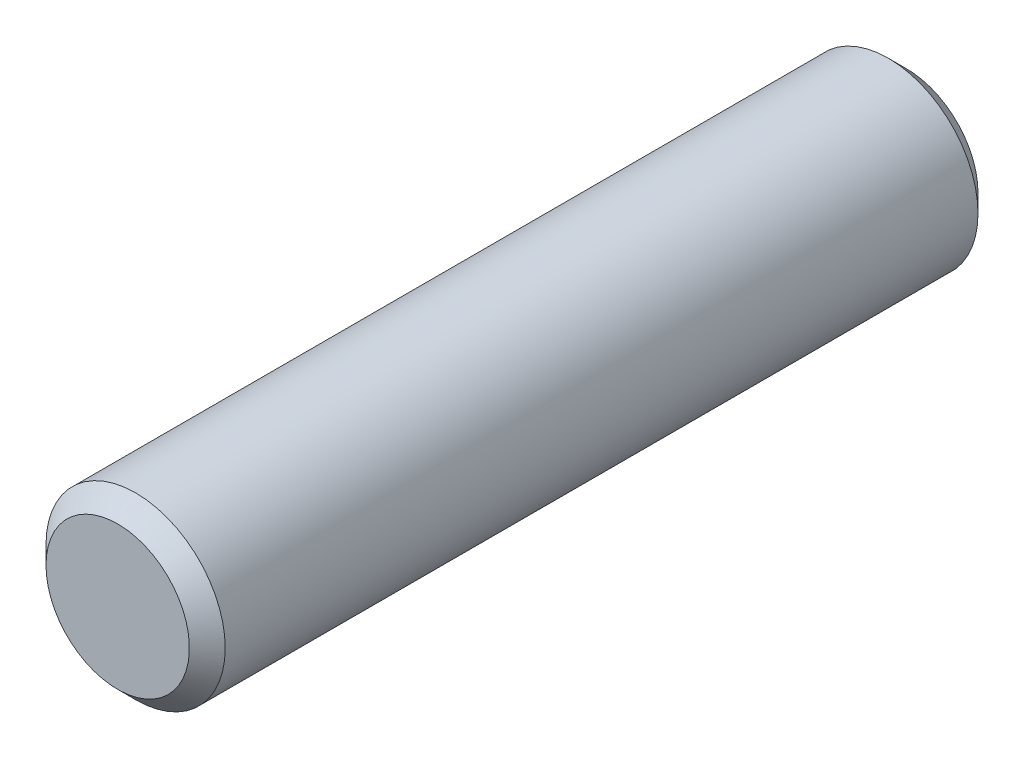
ISO-10303-21;
HEADER;
FILE_DESCRIPTION(('STEP AP214'),'2;1');
FILE_NAME('part.step','',(''),(''),'','','');
FILE_SCHEMA(('AUTOMOTIVE_DESIGN { 1 0 10303 214 1 1 1 1 }'));
ENDSEC;
DATA;
#1=APPLICATION_CONTEXT('core data for automotive mechanical design processes');
#2=APPLICATION_PROTOCOL_DEFINITION('international standard','automotive_design',2000,#1);
#3=PRODUCT_CONTEXT('',#1,'mechanical');
#4=PRODUCT('Part','Part','',(#3));
#5=PRODUCT_RELATED_PRODUCT_CATEGORY('part','',(#4));
#6=PRODUCT_DEFINITION_FORMATION('','',#4);
#7=PRODUCT_DEFINITION_CONTEXT('part definition',#1,'design');
#8=PRODUCT_DEFINITION('design','',#6,#7);
#9=PRODUCT_DEFINITION_SHAPE('','',#8);
#10=(LENGTH_UNIT() NAMED_UNIT(*) SI_UNIT(.MILLI.,.METRE.));
#11=(NAMED_UNIT(*) PLANE_ANGLE_UNIT() SI_UNIT($,.RADIAN.));
#12=(NAMED_UNIT(*) SI_UNIT($,.STERADIAN.) SOLID_ANGLE_UNIT());
#13=UNCERTAINTY_MEASURE_WITH_UNIT(LENGTH_MEASURE(1.E-05),#10,'distance_accuracy_value','');
#14=(GEOMETRIC_REPRESENTATION_CONTEXT(3) GLOBAL_UNCERTAINTY_ASSIGNED_CONTEXT((#13)) GLOBAL_UNIT_ASSIGNED_CONTEXT((#10,
#11,#12)) REPRESENTATION_CONTEXT('',''));
#15=CARTESIAN_POINT('',(0.,0.,0.));
#16=DIRECTION('',(0.,0.,1.));
#17=DIRECTION('',(1.,0.,0.));
#18=AXIS2_PLACEMENT_3D('',#15,#16,#17);
#19=CARTESIAN_POINT('',(0.,0.,22.));
#20=DIRECTION('',(0.,0.,-1.));
#21=DIRECTION('',(-1.,0.,0.));
#22=AXIS2_PLACEMENT_3D('',#19,#20,#21);
#23=PLANE('',#22);
#24=CARTESIAN_POINT('',(0.,0.,22.0000000002756));
#25=DIRECTION('',(0.,0.,-1.));
#26=DIRECTION('',(-1.,0.,0.));
#27=AXIS2_PLACEMENT_3D('',#24,#25,#26);
#28=CIRCLE('',#27,2.00000000018008);
#29=CARTESIAN_POINT('',(-2.00000000018008,0.,22.0000000002756));
#30=VERTEX_POINT('',#29);
#31=EDGE_CURVE('E18',#30,#30,#28,.T.);
#32=ORIENTED_EDGE('',*,*,#31,.F.);
#33=EDGE_LOOP('',(#32));
#34=FACE_BOUND('',#33,.T.);
#35=ADVANCED_FACE('F15',(#34),#23,.F.);
#36=CARTESIAN_POINT('',(0.,0.,0.));
#37=DIRECTION('',(0.,0.,-1.));
#38=DIRECTION('',(-1.,0.,0.));
#39=AXIS2_PLACEMENT_3D('',#36,#37,#38);
#40=PLANE('',#39);
#41=CARTESIAN_POINT('',(0.,0.,-2.27373675443232E-10));
#42=DIRECTION('',(0.,0.,1.));
#43=DIRECTION('',(1.,0.,0.));
#44=AXIS2_PLACEMENT_3D('',#41,#42,#43);
#45=CIRCLE('',#44,2.00000000023692);
#46=CARTESIAN_POINT('',(2.00000000023692,0.,-2.27373675443232E-10));
#47=VERTEX_POINT('',#46);
#48=EDGE_CURVE('E27',#47,#47,#45,.T.);
#49=ORIENTED_EDGE('',*,*,#48,.F.);
#50=EDGE_LOOP('',(#49));
#51=FACE_BOUND('',#50,.T.);
#52=ADVANCED_FACE('F42',(#51),#40,.T.);
#53=CARTESIAN_POINT('',(0.,0.,21.499999999719));
#54=DIRECTION('',(0.,0.,-1.));
#55=DIRECTION('',(-1.,0.,0.));
#56=AXIS2_PLACEMENT_3D('',#53,#54,#55);
#57=CONICAL_SURFACE('',#56,2.4999999998272,0.785398162487954);
#58=CARTESIAN_POINT('',(0.,0.,21.5));
#59=DIRECTION('',(0.,0.,1.));
#60=DIRECTION('',(1.,0.,0.));
#61=AXIS2_PLACEMENT_3D('',#58,#59,#60);
#62=CIRCLE('',#61,2.5);
#63=CARTESIAN_POINT('',(2.5,0.,21.5));
#64=VERTEX_POINT('',#63);
#65=EDGE_CURVE('E22',#64,#64,#62,.F.);
#66=ORIENTED_EDGE('',*,*,#65,.F.);
#67=EDGE_LOOP('',(#66));
#68=FACE_BOUND('',#67,.T.);
#69=ORIENTED_EDGE('',*,*,#31,.T.);
#70=EDGE_LOOP('',(#69));
#71=FACE_BOUND('',#70,.T.);
#72=ADVANCED_FACE('F39',(#68,#71),#57,.T.);
#73=CARTESIAN_POINT('',(0.,0.,0.50000000021555));
#74=DIRECTION('',(0.,0.,1.));
#75=DIRECTION('',(1.,0.,0.));
#76=AXIS2_PLACEMENT_3D('',#73,#74,#75);
#77=CONICAL_SURFACE('',#76,2.4999999998272,0.785398162544797);
#78=ORIENTED_EDGE('',*,*,#48,.T.);
#79=EDGE_LOOP('',(#78));
#80=FACE_BOUND('',#79,.T.);
#81=CARTESIAN_POINT('',(0.,0.,0.5));
#82=DIRECTION('',(0.,0.,1.));
#83=DIRECTION('',(1.,0.,0.));
#84=AXIS2_PLACEMENT_3D('',#81,#82,#83);
#85=CIRCLE('',#84,2.5);
#86=CARTESIAN_POINT('',(2.5,0.,0.5));
#87=VERTEX_POINT('',#86);
#88=EDGE_CURVE('E10',#87,#87,#85,.T.);
#89=ORIENTED_EDGE('',*,*,#88,.F.);
#90=EDGE_LOOP('',(#89));
#91=FACE_BOUND('',#90,.T.);
#92=ADVANCED_FACE('F50',(#80,#91),#77,.T.);
#93=CARTESIAN_POINT('',(0.,0.,0.));
#94=DIRECTION('',(0.,0.,1.));
#95=DIRECTION('',(1.,0.,0.));
#96=AXIS2_PLACEMENT_3D('',#93,#94,#95);
#97=CYLINDRICAL_SURFACE('',#96,2.5);
#98=ORIENTED_EDGE('',*,*,#88,.T.);
#99=EDGE_LOOP('',(#98));
#100=FACE_BOUND('',#99,.T.);
#101=ORIENTED_EDGE('',*,*,#65,.T.);
#102=EDGE_LOOP('',(#101));
#103=FACE_BOUND('',#102,.T.);
#104=ADVANCED_FACE('F48',(#100,#103),#97,.T.);
#105=CLOSED_SHELL('',(#35,#52,#72,#92,#104));
#106=MANIFOLD_SOLID_BREP('B1',#105);
#107=ADVANCED_BREP_SHAPE_REPRESENTATION('',(#18,#106),#14);
#108=SHAPE_DEFINITION_REPRESENTATION(#9,#107);
ENDSEC;
END-ISO-10303-21;
